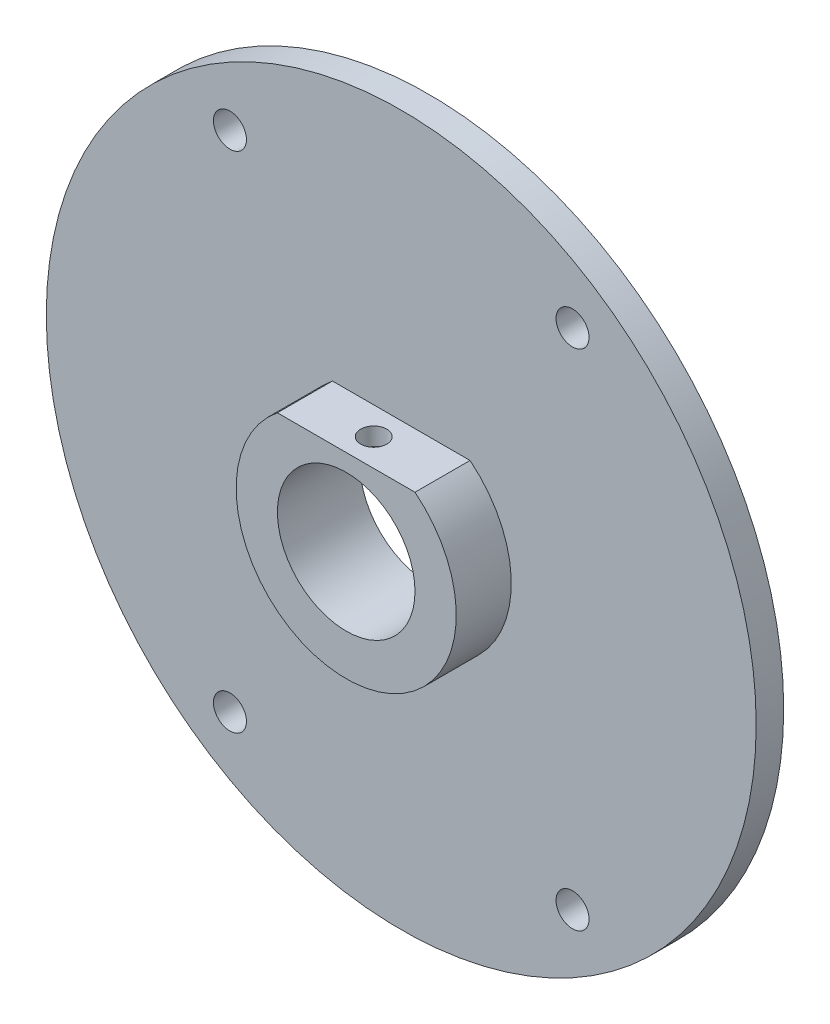
ISO-10303-21;
HEADER;
FILE_DESCRIPTION(('STEP AP214'),'2;1');
FILE_NAME('part.step','',(''),(''),'','','');
FILE_SCHEMA(('AUTOMOTIVE_DESIGN { 1 0 10303 214 1 1 1 1 }'));
ENDSEC;
DATA;
#1=APPLICATION_CONTEXT('core data for automotive mechanical design processes');
#2=APPLICATION_PROTOCOL_DEFINITION('international standard','automotive_design',2000,#1);
#3=PRODUCT_CONTEXT('',#1,'mechanical');
#4=PRODUCT('Part','Part','',(#3));
#5=PRODUCT_RELATED_PRODUCT_CATEGORY('part','',(#4));
#6=PRODUCT_DEFINITION_FORMATION('','',#4);
#7=PRODUCT_DEFINITION_CONTEXT('part definition',#1,'design');
#8=PRODUCT_DEFINITION('design','',#6,#7);
#9=PRODUCT_DEFINITION_SHAPE('','',#8);
#10=(LENGTH_UNIT() NAMED_UNIT(*) SI_UNIT(.MILLI.,.METRE.));
#11=(NAMED_UNIT(*) PLANE_ANGLE_UNIT() SI_UNIT($,.RADIAN.));
#12=(NAMED_UNIT(*) SI_UNIT($,.STERADIAN.) SOLID_ANGLE_UNIT());
#13=UNCERTAINTY_MEASURE_WITH_UNIT(LENGTH_MEASURE(1.E-05),#10,'distance_accuracy_value','');
#14=(GEOMETRIC_REPRESENTATION_CONTEXT(3) GLOBAL_UNCERTAINTY_ASSIGNED_CONTEXT((#13)) GLOBAL_UNIT_ASSIGNED_CONTEXT((#10,
#11,#12)) REPRESENTATION_CONTEXT('',''));
#15=CARTESIAN_POINT('',(0.,0.,0.));
#16=DIRECTION('',(0.,0.,1.));
#17=DIRECTION('',(1.,0.,0.));
#18=AXIS2_PLACEMENT_3D('',#15,#16,#17);
#19=CARTESIAN_POINT('',(51.5494286470437,-18.3129806540191,2.));
#20=DIRECTION('',(0.,0.,-1.));
#21=DIRECTION('',(-1.,0.,0.));
#22=AXIS2_PLACEMENT_3D('',#19,#20,#21);
#23=CYLINDRICAL_SURFACE('',#22,1.2);
#24=CARTESIAN_POINT('',(51.5494286470437,-18.3129806540191,2.));
#25=DIRECTION('',(0.,0.,1.));
#26=DIRECTION('',(1.,0.,0.));
#27=AXIS2_PLACEMENT_3D('',#24,#25,#26);
#28=CIRCLE('',#27,1.2);
#29=CARTESIAN_POINT('',(52.7494286470437,-18.3129806540191,2.));
#30=VERTEX_POINT('',#29);
#31=EDGE_CURVE('E50',#30,#30,#28,.T.);
#32=ORIENTED_EDGE('',*,*,#31,.T.);
#33=EDGE_LOOP('',(#32));
#34=FACE_BOUND('',#33,.T.);
#35=CARTESIAN_POINT('',(51.5494286470437,-18.3129806540191,0.));
#36=DIRECTION('',(0.,0.,1.));
#37=DIRECTION('',(1.,0.,0.));
#38=AXIS2_PLACEMENT_3D('',#35,#36,#37);
#39=CIRCLE('',#38,1.2);
#40=CARTESIAN_POINT('',(52.7494286470437,-18.3129806540191,0.));
#41=VERTEX_POINT('',#40);
#42=EDGE_CURVE('E117',#41,#41,#39,.T.);
#43=ORIENTED_EDGE('',*,*,#42,.F.);
#44=EDGE_LOOP('',(#43));
#45=FACE_BOUND('',#44,.T.);
#46=ADVANCED_FACE('F41',(#34,#45),#23,.F.);
#47=CARTESIAN_POINT('',(76.4505713529564,-18.3129806540191,2.));
#48=DIRECTION('',(0.,0.,-1.));
#49=DIRECTION('',(-1.,0.,0.));
#50=AXIS2_PLACEMENT_3D('',#47,#48,#49);
#51=CYLINDRICAL_SURFACE('',#50,1.2);
#52=CARTESIAN_POINT('',(76.4505713529564,-18.3129806540191,2.));
#53=DIRECTION('',(0.,0.,1.));
#54=DIRECTION('',(1.,0.,0.));
#55=AXIS2_PLACEMENT_3D('',#52,#53,#54);
#56=CIRCLE('',#55,1.2);
#57=CARTESIAN_POINT('',(77.6505713529564,-18.3129806540191,2.));
#58=VERTEX_POINT('',#57);
#59=EDGE_CURVE('E102',#58,#58,#56,.T.);
#60=ORIENTED_EDGE('',*,*,#59,.T.);
#61=EDGE_LOOP('',(#60));
#62=FACE_BOUND('',#61,.T.);
#63=CARTESIAN_POINT('',(76.4505713529564,-18.3129806540191,0.));
#64=DIRECTION('',(0.,0.,1.));
#65=DIRECTION('',(1.,0.,0.));
#66=AXIS2_PLACEMENT_3D('',#63,#64,#65);
#67=CIRCLE('',#66,1.2);
#68=CARTESIAN_POINT('',(77.6505713529564,-18.3129806540191,0.));
#69=VERTEX_POINT('',#68);
#70=EDGE_CURVE('E115',#69,#69,#67,.T.);
#71=ORIENTED_EDGE('',*,*,#70,.F.);
#72=EDGE_LOOP('',(#71));
#73=FACE_BOUND('',#72,.T.);
#74=ADVANCED_FACE('F140',(#62,#73),#51,.F.);
#75=CARTESIAN_POINT('',(76.4505713529564,18.3129806540191,2.));
#76=DIRECTION('',(0.,0.,-1.));
#77=DIRECTION('',(-1.,0.,0.));
#78=AXIS2_PLACEMENT_3D('',#75,#76,#77);
#79=CYLINDRICAL_SURFACE('',#78,1.2);
#80=CARTESIAN_POINT('',(76.4505713529564,18.3129806540191,2.));
#81=DIRECTION('',(0.,0.,1.));
#82=DIRECTION('',(1.,0.,0.));
#83=AXIS2_PLACEMENT_3D('',#80,#81,#82);
#84=CIRCLE('',#83,1.2);
#85=CARTESIAN_POINT('',(77.6505713529564,18.3129806540191,2.));
#86=VERTEX_POINT('',#85);
#87=EDGE_CURVE('E99',#86,#86,#84,.T.);
#88=ORIENTED_EDGE('',*,*,#87,.T.);
#89=EDGE_LOOP('',(#88));
#90=FACE_BOUND('',#89,.T.);
#91=CARTESIAN_POINT('',(76.4505713529564,18.3129806540191,0.));
#92=DIRECTION('',(0.,0.,1.));
#93=DIRECTION('',(1.,0.,0.));
#94=AXIS2_PLACEMENT_3D('',#91,#92,#93);
#95=CIRCLE('',#94,1.2);
#96=CARTESIAN_POINT('',(77.6505713529564,18.3129806540191,0.));
#97=VERTEX_POINT('',#96);
#98=EDGE_CURVE('E112',#97,#97,#95,.T.);
#99=ORIENTED_EDGE('',*,*,#98,.F.);
#100=EDGE_LOOP('',(#99));
#101=FACE_BOUND('',#100,.T.);
#102=ADVANCED_FACE('F145',(#90,#101),#79,.F.);
#103=CARTESIAN_POINT('',(64.,0.,2.));
#104=DIRECTION('',(0.,0.,-1.));
#105=DIRECTION('',(-1.,0.,0.));
#106=AXIS2_PLACEMENT_3D('',#103,#104,#105);
#107=CYLINDRICAL_SURFACE('',#106,5.);
#108=CARTESIAN_POINT('',(63.05,4.90892045158608,4.));
#109=CARTESIAN_POINT('',(63.0500020132062,4.90892148091532,3.94715741366946));
#110=CARTESIAN_POINT('',(63.0544239179235,4.9097829643861,3.89428885930885));
#111=CARTESIAN_POINT('',(63.0719822297264,4.91313137401494,3.79004346312261));
#112=CARTESIAN_POINT('',(63.0851259474184,4.91561966373296,3.73866791046779));
#113=CARTESIAN_POINT('',(63.1197088745895,4.92192992891011,3.63893190697733));
#114=CARTESIAN_POINT('',(63.1411402547229,4.92575064529372,3.59056866033684));
#115=CARTESIAN_POINT('',(63.1916692719898,4.93429377279076,3.49812682103057));
#116=CARTESIAN_POINT('',(63.2207663443028,4.9390161174637,3.45404791301513));
#117=CARTESIAN_POINT('',(63.2861970310985,4.94889780359755,3.37085975190324));
#118=CARTESIAN_POINT('',(63.3226096960164,4.95406152989716,3.3318131863317));
#119=CARTESIAN_POINT('',(63.401467109838,4.96420545600492,3.260344492003));
#120=CARTESIAN_POINT('',(63.4439122595728,4.96918564359004,3.22792280378787));
#121=CARTESIAN_POINT('',(63.5340421918438,4.97844839527452,3.17038338556982));
#122=CARTESIAN_POINT('',(63.5817654092071,4.98272518982659,3.14532485168414));
#123=CARTESIAN_POINT('',(63.6808393107579,4.99005016120535,3.10360456119177));
#124=CARTESIAN_POINT('',(63.7321896882646,4.99309844175862,3.08694209565392));
#125=CARTESIAN_POINT('',(63.8364104654206,4.99759195436722,3.06268102790152));
#126=CARTESIAN_POINT('',(63.8892554379253,4.99905586849493,3.05497671313409));
#127=CARTESIAN_POINT('',(63.9955068098174,5.00028012249334,3.04852117493967));
#128=CARTESIAN_POINT('',(64.0489131597624,5.00004061115594,3.04976916954065));
#129=CARTESIAN_POINT('',(64.1540460285693,4.99789957611539,3.06110192455562));
#130=CARTESIAN_POINT('',(64.2057853173045,4.99601946314024,3.0710728503223));
#131=CARTESIAN_POINT('',(64.3068427732325,4.99083251539859,3.09938828952232));
#132=CARTESIAN_POINT('',(64.3561608503783,4.98752562761384,3.11773311412702));
#133=CARTESIAN_POINT('',(64.4513050493518,4.9798210064765,3.16238348430179));
#134=CARTESIAN_POINT('',(64.4971093779437,4.97541708833793,3.18873435765382));
#135=CARTESIAN_POINT('',(64.5836885690989,4.96600513381039,3.248615394275));
#136=CARTESIAN_POINT('',(64.6244629063003,4.96099703442505,3.28214630647053));
#137=CARTESIAN_POINT('',(64.7004993591841,4.95083808537673,3.3560623470678));
#138=CARTESIAN_POINT('',(64.7356645881219,4.94568622961867,3.39654707294148));
#139=CARTESIAN_POINT('',(64.7987210321268,4.93589566652324,3.48289022538843));
#140=CARTESIAN_POINT('',(64.8266121350221,4.93125696709972,3.52874873481325));
#141=CARTESIAN_POINT('',(64.8743573509473,4.92301636075736,3.62466824190137));
#142=CARTESIAN_POINT('',(64.894197071016,4.91941631386451,3.67473657407467));
#143=CARTESIAN_POINT('',(64.9251551990443,4.91368885812605,3.77757983332188));
#144=CARTESIAN_POINT('',(64.936274623892,4.91156127757712,3.8303544440473));
#145=CARTESIAN_POINT('',(64.9493344105089,4.90905370129033,3.9362376409532));
#146=CARTESIAN_POINT('',(64.9514141087637,4.90864718006762,3.98932843102469));
#147=CARTESIAN_POINT('',(64.946709195124,4.90955672552316,4.09509859820437));
#148=CARTESIAN_POINT('',(64.9399250340512,4.91087270459392,4.14777799609915));
#149=CARTESIAN_POINT('',(64.9178046956463,4.91505423869383,4.25076992478733));
#150=CARTESIAN_POINT('',(64.9025418373682,4.91790650244438,4.30109879106682));
#151=CARTESIAN_POINT('',(64.8639752730846,4.92482773665892,4.39848486980461));
#152=CARTESIAN_POINT('',(64.8406709606462,4.92889679888264,4.44554183519632));
#153=CARTESIAN_POINT('',(64.7863633512527,4.93785339487549,4.53566137122243));
#154=CARTESIAN_POINT('',(64.7552721964297,4.94275004577349,4.57867007379975));
#155=CARTESIAN_POINT('',(64.6863916726589,4.95278456783932,4.65891034324553));
#156=CARTESIAN_POINT('',(64.6486016845398,4.95792246127285,4.69614137548834));
#157=CARTESIAN_POINT('',(64.5667732699838,4.96794596147723,4.76429151785302));
#158=CARTESIAN_POINT('',(64.5226560864032,4.97282712899734,4.79511682006888));
#159=CARTESIAN_POINT('',(64.4297882590803,4.98171202506854,4.84891778077986));
#160=CARTESIAN_POINT('',(64.3810377971357,4.98571578802634,4.87189374710008));
#161=CARTESIAN_POINT('',(64.2805439883383,4.99237569473471,4.90920412419332));
#162=CARTESIAN_POINT('',(64.2288180958164,4.99503895110893,4.9235842219983));
#163=CARTESIAN_POINT('',(64.1236298274635,4.99874814198404,4.94344027208973));
#164=CARTESIAN_POINT('',(64.0701676401179,4.99979425144091,4.94891718759751));
#165=CARTESIAN_POINT('',(63.9639232897384,5.00014767293015,4.95077713106788));
#166=CARTESIAN_POINT('',(63.9111436428844,4.99948205126067,4.94730171398539));
#167=CARTESIAN_POINT('',(63.8069349131027,4.99654317377276,4.93166616743447));
#168=CARTESIAN_POINT('',(63.7555058164765,4.9942699342667,4.91950612608821));
#169=CARTESIAN_POINT('',(63.6555355072741,4.98837138343047,4.88690680723652));
#170=CARTESIAN_POINT('',(63.6069890989241,4.98474859594536,4.86648297807461));
#171=CARTESIAN_POINT('',(63.5139912837495,4.97654271159106,4.8179529846238));
#172=CARTESIAN_POINT('',(63.4695401613752,4.97195954808843,4.78984628723574));
#173=CARTESIAN_POINT('',(63.385290394728,4.96225342535862,4.72626305430198));
#174=CARTESIAN_POINT('',(63.3455695768687,4.95712353310215,4.69068444294109));
#175=CARTESIAN_POINT('',(63.2726130692781,4.94694536822819,4.61337874597367));
#176=CARTESIAN_POINT('',(63.2393789087396,4.94189711511329,4.57165021461773));
#177=CARTESIAN_POINT('',(63.1800404431231,4.9324010851607,4.48275249864567));
#178=CARTESIAN_POINT('',(63.1540072061523,4.92795949852336,4.43553519326741));
#179=CARTESIAN_POINT('',(63.1102844840245,4.92025438404169,4.33732745378472));
#180=CARTESIAN_POINT('',(63.0925871825405,4.9169897532821,4.28634060637479));
#181=CARTESIAN_POINT('',(63.069603335212,4.91268325868357,4.19600827303358));
#182=CARTESIAN_POINT('',(63.0622647907485,4.91128065647118,4.15718908064603));
#183=CARTESIAN_POINT('',(63.0524624409283,4.90939888171853,4.07891807516357));
#184=CARTESIAN_POINT('',(63.0499984964067,4.90891968281606,4.03946628016123));
#185=CARTESIAN_POINT('',(63.05,4.90892045158608,4.));
#186=B_SPLINE_CURVE_WITH_KNOTS('',3,(#108,#109,#110,#111,#112,#113,#114,#115,#116,#117,#118,
#119,#120,#121,#122,#123,#124,#125,#126,#127,#128,#129,#130,#131,#132,#133,#134,#135,#136,#137,
#138,#139,#140,#141,#142,#143,#144,#145,#146,#147,#148,#149,#150,#151,#152,#153,#154,#155,#156,
#157,#158,#159,#160,#161,#162,#163,#164,#165,#166,#167,#168,#169,#170,#171,#172,#173,#174,#175,
#176,#177,#178,#179,#180,#181,#182,#183,#184,#185),.UNSPECIFIED.,.T.,.F.,(4,2,2,2,2,2,2,2,2,2,2,
2,2,2,2,2,2,2,2,2,2,2,2,2,2,2,2,2,2,2,2,2,2,2,2,2,2,2,4),(0.,0.158383316659447,
0.316899557878211,0.475266413367455,0.633621603389847,0.793790122452889,0.953969288960687,
1.11540303535277,1.27682314862589,1.43631841125413,1.59579974235816,1.75323036929046,
1.91066684677006,2.06901183785276,2.22737335343633,2.38822800669333,2.5490851402905,
2.71022857485679,2.8713532154267,3.02998530357324,3.18860932390139,3.34588253719162,
3.5031676135715,3.66231425910109,3.82147562219076,3.98282501975544,4.14416808900172,
4.30464581388714,4.46510617578344,4.62304495528747,4.7809821322224,4.93862541518447,
5.0962796394827,5.25624687046542,5.41625176738976,5.57778361782915,5.73916370226739,
5.85745804105404,5.97574900261007),.UNSPECIFIED.);
#187=CARTESIAN_POINT('',(63.05,4.90892045158608,4.));
#188=VERTEX_POINT('',#187);
#189=EDGE_CURVE('E86',#188,#188,#186,.T.);
#190=ORIENTED_EDGE('',*,*,#189,.F.);
#191=EDGE_LOOP('',(#190));
#192=FACE_BOUND('',#191,.T.);
#193=CARTESIAN_POINT('',(64.,0.,0.));
#194=DIRECTION('',(0.,0.,1.));
#195=DIRECTION('',(1.,0.,0.));
#196=AXIS2_PLACEMENT_3D('',#193,#194,#195);
#197=CIRCLE('',#196,5.);
#198=CARTESIAN_POINT('',(69.,0.,0.));
#199=VERTEX_POINT('',#198);
#200=EDGE_CURVE('E109',#199,#199,#197,.T.);
#201=ORIENTED_EDGE('',*,*,#200,.F.);
#202=EDGE_LOOP('',(#201));
#203=FACE_BOUND('',#202,.T.);
#204=CARTESIAN_POINT('',(64.,0.,6.));
#205=DIRECTION('',(0.,0.,1.));
#206=DIRECTION('',(1.,0.,0.));
#207=AXIS2_PLACEMENT_3D('',#204,#205,#206);
#208=CIRCLE('',#207,5.);
#209=CARTESIAN_POINT('',(69.,0.,6.));
#210=VERTEX_POINT('',#209);
#211=EDGE_CURVE('E79',#210,#210,#208,.F.);
#212=ORIENTED_EDGE('',*,*,#211,.F.);
#213=EDGE_LOOP('',(#212));
#214=FACE_BOUND('',#213,.T.);
#215=ADVANCED_FACE('F135',(#192,#203,#214),#107,.F.);
#216=CARTESIAN_POINT('',(64.,0.,2.));
#217=DIRECTION('',(0.,0.,-1.));
#218=DIRECTION('',(-1.,0.,0.));
#219=AXIS2_PLACEMENT_3D('',#216,#217,#218);
#220=CYLINDRICAL_SURFACE('',#219,25.8);
#221=CARTESIAN_POINT('',(64.,0.,2.));
#222=DIRECTION('',(0.,0.,1.));
#223=DIRECTION('',(1.,0.,0.));
#224=AXIS2_PLACEMENT_3D('',#221,#222,#223);
#225=CIRCLE('',#224,25.8);
#226=CARTESIAN_POINT('',(89.8,0.,2.));
#227=VERTEX_POINT('',#226);
#228=EDGE_CURVE('E96',#227,#227,#225,.T.);
#229=ORIENTED_EDGE('',*,*,#228,.F.);
#230=EDGE_LOOP('',(#229));
#231=FACE_BOUND('',#230,.T.);
#232=CARTESIAN_POINT('',(64.,0.,0.));
#233=DIRECTION('',(0.,0.,1.));
#234=DIRECTION('',(1.,0.,0.));
#235=AXIS2_PLACEMENT_3D('',#232,#233,#234);
#236=CIRCLE('',#235,25.8);
#237=CARTESIAN_POINT('',(89.8,0.,0.));
#238=VERTEX_POINT('',#237);
#239=EDGE_CURVE('E95',#238,#238,#236,.T.);
#240=ORIENTED_EDGE('',*,*,#239,.T.);
#241=EDGE_LOOP('',(#240));
#242=FACE_BOUND('',#241,.T.);
#243=ADVANCED_FACE('F43',(#231,#242),#220,.T.);
#244=CARTESIAN_POINT('',(51.5494286470437,18.3129806540191,2.));
#245=DIRECTION('',(0.,0.,-1.));
#246=DIRECTION('',(-1.,0.,0.));
#247=AXIS2_PLACEMENT_3D('',#244,#245,#246);
#248=CYLINDRICAL_SURFACE('',#247,1.2);
#249=CARTESIAN_POINT('',(51.5494286470437,18.3129806540191,2.));
#250=DIRECTION('',(0.,0.,1.));
#251=DIRECTION('',(1.,0.,0.));
#252=AXIS2_PLACEMENT_3D('',#249,#250,#251);
#253=CIRCLE('',#252,1.2);
#254=CARTESIAN_POINT('',(52.7494286470437,18.3129806540191,2.));
#255=VERTEX_POINT('',#254);
#256=EDGE_CURVE('E11',#255,#255,#253,.T.);
#257=ORIENTED_EDGE('',*,*,#256,.T.);
#258=EDGE_LOOP('',(#257));
#259=FACE_BOUND('',#258,.T.);
#260=CARTESIAN_POINT('',(51.5494286470437,18.3129806540191,0.));
#261=DIRECTION('',(0.,0.,1.));
#262=DIRECTION('',(1.,0.,0.));
#263=AXIS2_PLACEMENT_3D('',#260,#261,#262);
#264=CIRCLE('',#263,1.2);
#265=CARTESIAN_POINT('',(52.7494286470437,18.3129806540191,0.));
#266=VERTEX_POINT('',#265);
#267=EDGE_CURVE('E45',#266,#266,#264,.T.);
#268=ORIENTED_EDGE('',*,*,#267,.F.);
#269=EDGE_LOOP('',(#268));
#270=FACE_BOUND('',#269,.T.);
#271=ADVANCED_FACE('F126',(#259,#270),#248,.F.);
#272=CARTESIAN_POINT('',(0.,0.,2.));
#273=DIRECTION('',(0.,0.,1.));
#274=DIRECTION('',(1.,0.,0.));
#275=AXIS2_PLACEMENT_3D('',#272,#273,#274);
#276=PLANE('',#275);
#277=CARTESIAN_POINT('',(64.,0.,2.));
#278=DIRECTION('',(0.,0.,1.));
#279=DIRECTION('',(1.,0.,0.));
#280=AXIS2_PLACEMENT_3D('',#277,#278,#279);
#281=CIRCLE('',#280,8.00000000000001);
#282=CARTESIAN_POINT('',(59.,6.24499799839841,2.));
#283=VERTEX_POINT('',#282);
#284=CARTESIAN_POINT('',(69.,6.24499799839842,2.));
#285=VERTEX_POINT('',#284);
#286=EDGE_CURVE('E73',#283,#285,#281,.T.);
#287=ORIENTED_EDGE('',*,*,#286,.F.);
#288=DIRECTION('',(-1.,0.,0.));
#289=VECTOR('',#288,1.);
#290=CARTESIAN_POINT('',(0.,6.24499799839841,2.));
#291=LINE('',#290,#289);
#292=EDGE_CURVE('E58',#285,#283,#291,.T.);
#293=ORIENTED_EDGE('',*,*,#292,.F.);
#294=EDGE_LOOP('',(#287,#293));
#295=FACE_BOUND('',#294,.T.);
#296=ORIENTED_EDGE('',*,*,#228,.T.);
#297=EDGE_LOOP('',(#296));
#298=FACE_BOUND('',#297,.T.);
#299=ORIENTED_EDGE('',*,*,#87,.F.);
#300=EDGE_LOOP('',(#299));
#301=FACE_BOUND('',#300,.T.);
#302=ORIENTED_EDGE('',*,*,#59,.F.);
#303=EDGE_LOOP('',(#302));
#304=FACE_BOUND('',#303,.T.);
#305=ORIENTED_EDGE('',*,*,#31,.F.);
#306=EDGE_LOOP('',(#305));
#307=FACE_BOUND('',#306,.T.);
#308=ORIENTED_EDGE('',*,*,#256,.F.);
#309=EDGE_LOOP('',(#308));
#310=FACE_BOUND('',#309,.T.);
#311=ADVANCED_FACE('F84',(#295,#298,#301,#304,#307,#310),#276,.T.);
#312=CARTESIAN_POINT('',(0.,0.,0.));
#313=DIRECTION('',(0.,0.,1.));
#314=DIRECTION('',(1.,0.,0.));
#315=AXIS2_PLACEMENT_3D('',#312,#313,#314);
#316=PLANE('',#315);
#317=ORIENTED_EDGE('',*,*,#239,.F.);
#318=EDGE_LOOP('',(#317));
#319=FACE_BOUND('',#318,.T.);
#320=ORIENTED_EDGE('',*,*,#200,.T.);
#321=EDGE_LOOP('',(#320));
#322=FACE_BOUND('',#321,.T.);
#323=ORIENTED_EDGE('',*,*,#98,.T.);
#324=EDGE_LOOP('',(#323));
#325=FACE_BOUND('',#324,.T.);
#326=ORIENTED_EDGE('',*,*,#70,.T.);
#327=EDGE_LOOP('',(#326));
#328=FACE_BOUND('',#327,.T.);
#329=ORIENTED_EDGE('',*,*,#42,.T.);
#330=EDGE_LOOP('',(#329));
#331=FACE_BOUND('',#330,.T.);
#332=ORIENTED_EDGE('',*,*,#267,.T.);
#333=EDGE_LOOP('',(#332));
#334=FACE_BOUND('',#333,.T.);
#335=ADVANCED_FACE('F124',(#319,#322,#325,#328,#331,#334),#316,.F.);
#336=CARTESIAN_POINT('',(0.,6.24499799839841,6.));
#337=DIRECTION('',(0.,-1.,0.));
#338=DIRECTION('',(1.,0.,0.));
#339=AXIS2_PLACEMENT_3D('',#336,#337,#338);
#340=PLANE('',#339);
#341=CARTESIAN_POINT('',(64.,6.24499799839842,4.));
#342=DIRECTION('',(0.,1.,0.));
#343=DIRECTION('',(-1.,0.,0.));
#344=AXIS2_PLACEMENT_3D('',#341,#342,#343);
#345=CIRCLE('',#344,0.950000000000002);
#346=CARTESIAN_POINT('',(63.05,6.24499799839842,4.));
#347=VERTEX_POINT('',#346);
#348=EDGE_CURVE('E89',#347,#347,#345,.T.);
#349=ORIENTED_EDGE('',*,*,#348,.F.);
#350=EDGE_LOOP('',(#349));
#351=FACE_BOUND('',#350,.T.);
#352=ORIENTED_EDGE('',*,*,#292,.T.);
#353=DIRECTION('',(0.,0.,-1.));
#354=VECTOR('',#353,1.);
#355=CARTESIAN_POINT('',(59.,6.24499799839842,6.));
#356=LINE('',#355,#354);
#357=CARTESIAN_POINT('',(59.,6.24499799839842,6.));
#358=VERTEX_POINT('',#357);
#359=EDGE_CURVE('E77',#358,#283,#356,.T.);
#360=ORIENTED_EDGE('',*,*,#359,.F.);
#361=DIRECTION('',(-1.,0.,0.));
#362=VECTOR('',#361,1.);
#363=CARTESIAN_POINT('',(0.,6.24499799839841,6.));
#364=LINE('',#363,#362);
#365=CARTESIAN_POINT('',(69.,6.24499799839842,6.));
#366=VERTEX_POINT('',#365);
#367=EDGE_CURVE('E82',#366,#358,#364,.T.);
#368=ORIENTED_EDGE('',*,*,#367,.F.);
#369=DIRECTION('',(0.,0.,-1.));
#370=VECTOR('',#369,1.);
#371=CARTESIAN_POINT('',(69.,6.24499799839842,6.));
#372=LINE('',#371,#370);
#373=EDGE_CURVE('E75',#366,#285,#372,.T.);
#374=ORIENTED_EDGE('',*,*,#373,.T.);
#375=EDGE_LOOP('',(#352,#360,#368,#374));
#376=FACE_BOUND('',#375,.T.);
#377=ADVANCED_FACE('F81',(#351,#376),#340,.F.);
#378=CARTESIAN_POINT('',(64.,0.,6.));
#379=DIRECTION('',(0.,0.,-1.));
#380=DIRECTION('',(-1.,0.,0.));
#381=AXIS2_PLACEMENT_3D('',#378,#379,#380);
#382=CYLINDRICAL_SURFACE('',#381,8.00000000000001);
#383=ORIENTED_EDGE('',*,*,#286,.T.);
#384=ORIENTED_EDGE('',*,*,#373,.F.);
#385=CARTESIAN_POINT('',(64.,0.,6.));
#386=DIRECTION('',(0.,0.,1.));
#387=DIRECTION('',(1.,0.,0.));
#388=AXIS2_PLACEMENT_3D('',#385,#386,#387);
#389=CIRCLE('',#388,8.00000000000001);
#390=EDGE_CURVE('E66',#358,#366,#389,.T.);
#391=ORIENTED_EDGE('',*,*,#390,.F.);
#392=ORIENTED_EDGE('',*,*,#359,.T.);
#393=EDGE_LOOP('',(#383,#384,#391,#392));
#394=FACE_BOUND('',#393,.T.);
#395=ADVANCED_FACE('F74',(#394),#382,.T.);
#396=CARTESIAN_POINT('',(0.,0.,6.));
#397=DIRECTION('',(0.,0.,1.));
#398=DIRECTION('',(1.,0.,0.));
#399=AXIS2_PLACEMENT_3D('',#396,#397,#398);
#400=PLANE('',#399);
#401=ORIENTED_EDGE('',*,*,#211,.T.);
#402=EDGE_LOOP('',(#401));
#403=FACE_BOUND('',#402,.T.);
#404=ORIENTED_EDGE('',*,*,#367,.T.);
#405=ORIENTED_EDGE('',*,*,#390,.T.);
#406=EDGE_LOOP('',(#404,#405));
#407=FACE_BOUND('',#406,.T.);
#408=ADVANCED_FACE('F165',(#403,#407),#400,.T.);
#409=CARTESIAN_POINT('',(64.,2.24499799839842,4.));
#410=DIRECTION('',(0.,1.,0.));
#411=DIRECTION('',(-1.,0.,0.));
#412=AXIS2_PLACEMENT_3D('',#409,#410,#411);
#413=CYLINDRICAL_SURFACE('',#412,0.950000000000002);
#414=ORIENTED_EDGE('',*,*,#189,.T.);
#415=EDGE_LOOP('',(#414));
#416=FACE_BOUND('',#415,.T.);
#417=ORIENTED_EDGE('',*,*,#348,.T.);
#418=EDGE_LOOP('',(#417));
#419=FACE_BOUND('',#418,.T.);
#420=ADVANCED_FACE('F161',(#416,#419),#413,.F.);
#421=CLOSED_SHELL('',(#46,#74,#102,#215,#243,#271,#311,#335,#377,#395,#408,#420));
#422=MANIFOLD_SOLID_BREP('B2',#421);
#423=ADVANCED_BREP_SHAPE_REPRESENTATION('',(#18,#422),#14);
#424=SHAPE_DEFINITION_REPRESENTATION(#9,#423);
ENDSEC;
END-ISO-10303-21;
